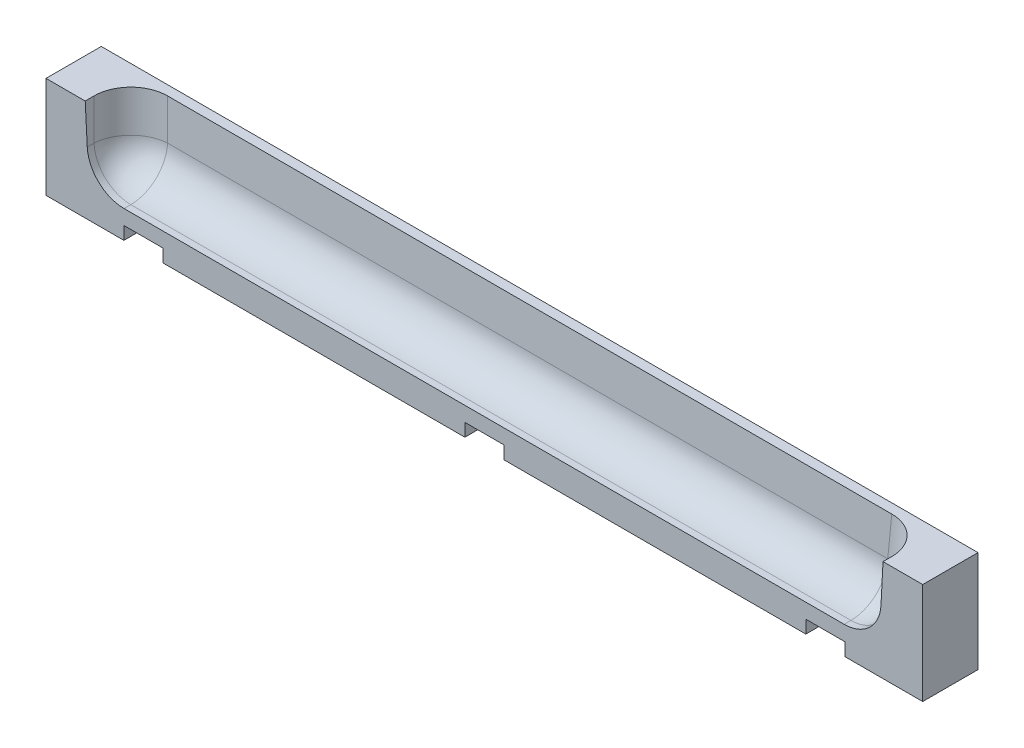
ISO-10303-21;
HEADER;
FILE_DESCRIPTION(('STEP AP214'),'2;1');
FILE_NAME('part.step','',(''),(''),'','','');
FILE_SCHEMA(('AUTOMOTIVE_DESIGN { 1 0 10303 214 1 1 1 1 }'));
ENDSEC;
DATA;
#1=APPLICATION_CONTEXT('core data for automotive mechanical design processes');
#2=APPLICATION_PROTOCOL_DEFINITION('international standard','automotive_design',2000,#1);
#3=PRODUCT_CONTEXT('',#1,'mechanical');
#4=PRODUCT('Part','Part','',(#3));
#5=PRODUCT_RELATED_PRODUCT_CATEGORY('part','',(#4));
#6=PRODUCT_DEFINITION_FORMATION('','',#4);
#7=PRODUCT_DEFINITION_CONTEXT('part definition',#1,'design');
#8=PRODUCT_DEFINITION('design','',#6,#7);
#9=PRODUCT_DEFINITION_SHAPE('','',#8);
#10=(LENGTH_UNIT() NAMED_UNIT(*) SI_UNIT(.MILLI.,.METRE.));
#11=(NAMED_UNIT(*) PLANE_ANGLE_UNIT() SI_UNIT($,.RADIAN.));
#12=(NAMED_UNIT(*) SI_UNIT($,.STERADIAN.) SOLID_ANGLE_UNIT());
#13=UNCERTAINTY_MEASURE_WITH_UNIT(LENGTH_MEASURE(1.E-05),#10,'distance_accuracy_value','');
#14=(GEOMETRIC_REPRESENTATION_CONTEXT(3) GLOBAL_UNCERTAINTY_ASSIGNED_CONTEXT((#13)) GLOBAL_UNIT_ASSIGNED_CONTEXT((#10,
#11,#12)) REPRESENTATION_CONTEXT('',''));
#15=CARTESIAN_POINT('',(0.,0.,0.));
#16=DIRECTION('',(0.,0.,1.));
#17=DIRECTION('',(1.,0.,0.));
#18=AXIS2_PLACEMENT_3D('',#15,#16,#17);
#19=CARTESIAN_POINT('',(-49.2182375036744,20.,-67.8890673333311));
#20=DIRECTION('',(1.,0.,0.));
#21=DIRECTION('',(0.,0.,-1.));
#22=AXIS2_PLACEMENT_3D('',#19,#20,#21);
#23=CYLINDRICAL_SURFACE('',#22,10.);
#24=DIRECTION('',(1.,0.,0.));
#25=VECTOR('',#24,1.);
#26=CARTESIAN_POINT('',(-49.2182375036744,19.4766404375705,-77.8753626808768));
#27=LINE('',#26,#25);
#28=CARTESIAN_POINT('',(42.3499687326921,19.4766404375705,-77.8753626808768));
#29=VERTEX_POINT('',#28);
#30=CARTESIAN_POINT('',(237.697151459334,19.4766404375705,-77.8753626808768));
#31=VERTEX_POINT('',#30);
#32=EDGE_CURVE('E290',#29,#31,#27,.T.);
#33=ORIENTED_EDGE('',*,*,#32,.F.);
#34=CARTESIAN_POINT('',(42.3499687326921,20.,-67.8890673333311));
#35=DIRECTION('',(1.,0.,0.));
#36=DIRECTION('',(0.,0.,-1.));
#37=AXIS2_PLACEMENT_3D('',#34,#35,#36);
#38=CIRCLE('',#37,10.);
#39=CARTESIAN_POINT('',(42.3499687326921,10.,-67.8890673333311));
#40=VERTEX_POINT('',#39);
#41=EDGE_CURVE('E314',#29,#40,#38,.F.);
#42=ORIENTED_EDGE('',*,*,#41,.T.);
#43=DIRECTION('',(1.,0.,0.));
#44=VECTOR('',#43,1.);
#45=CARTESIAN_POINT('',(0.,10.,-67.8890673333311));
#46=LINE('',#45,#44);
#47=CARTESIAN_POINT('',(237.697151459334,10.,-67.8890673333311));
#48=VERTEX_POINT('',#47);
#49=EDGE_CURVE('E281',#48,#40,#46,.F.);
#50=ORIENTED_EDGE('',*,*,#49,.F.);
#51=CARTESIAN_POINT('',(237.697151459334,20.,-67.8890673333311));
#52=DIRECTION('',(1.,0.,0.));
#53=DIRECTION('',(0.,0.,-1.));
#54=AXIS2_PLACEMENT_3D('',#51,#52,#53);
#55=CIRCLE('',#54,10.);
#56=EDGE_CURVE('E312',#48,#31,#55,.T.);
#57=ORIENTED_EDGE('',*,*,#56,.T.);
#58=EDGE_LOOP('',(#33,#42,#50,#57));
#59=FACE_BOUND('',#58,.T.);
#60=ADVANCED_FACE('F43',(#59),#23,.F.);
#61=CARTESIAN_POINT('',(42.3499687326921,20.,-67.8890673333311));
#62=DIRECTION('',(0.,0.,1.));
#63=DIRECTION('',(1.,0.,0.));
#64=AXIS2_PLACEMENT_3D('',#61,#62,#63);
#65=SPHERICAL_SURFACE('',#64,10.);
#66=CARTESIAN_POINT('',(42.3499687326921,20.,-67.8890673333311));
#67=DIRECTION('',(0.,0.,-1.));
#68=DIRECTION('',(-1.,0.,0.));
#69=AXIS2_PLACEMENT_3D('',#66,#67,#68);
#70=CIRCLE('',#69,10.);
#71=CARTESIAN_POINT('',(32.3636733851464,19.4766404375706,-67.8890673333311));
#72=VERTEX_POINT('',#71);
#73=EDGE_CURVE('E316',#40,#72,#70,.T.);
#74=ORIENTED_EDGE('',*,*,#73,.F.);
#75=ORIENTED_EDGE('',*,*,#41,.F.);
#76=CARTESIAN_POINT('',(42.3499687326921,20.,-67.8890673333311));
#77=DIRECTION('',(0.05226442768871,-0.997264688634237,0.0522644276887183));
#78=DIRECTION('',(0.,-0.0523359562429482,-0.998629534754574));
#79=AXIS2_PLACEMENT_3D('',#76,#77,#78);
#80=CIRCLE('',#79,10.);
#81=EDGE_CURVE('E225',#72,#29,#80,.T.);
#82=ORIENTED_EDGE('',*,*,#81,.F.);
#83=EDGE_LOOP('',(#74,#75,#82));
#84=FACE_BOUND('',#83,.T.);
#85=ADVANCED_FACE('F431',(#84),#65,.F.);
#86=CARTESIAN_POINT('',(0.,10.,0.));
#87=DIRECTION('',(0.,-1.,0.));
#88=DIRECTION('',(0.,0.,-1.));
#89=AXIS2_PLACEMENT_3D('',#86,#87,#88);
#90=PLANE('',#89);
#91=DIRECTION('',(0.,0.,-1.));
#92=VECTOR('',#91,1.);
#93=CARTESIAN_POINT('',(42.3499687326921,10.,0.));
#94=LINE('',#93,#92);
#95=CARTESIAN_POINT('',(42.3499687326921,10.,-66.0627350395195));
#96=VERTEX_POINT('',#95);
#97=EDGE_CURVE('E266',#40,#96,#94,.F.);
#98=ORIENTED_EDGE('',*,*,#97,.T.);
#99=DIRECTION('',(1.,0.,0.));
#100=VECTOR('',#99,1.);
#101=CARTESIAN_POINT('',(0.,10.,-66.0627350395195));
#102=LINE('',#101,#100);
#103=CARTESIAN_POINT('',(237.697151459334,10.,-66.0627350395195));
#104=VERTEX_POINT('',#103);
#105=EDGE_CURVE('E327',#96,#104,#102,.T.);
#106=ORIENTED_EDGE('',*,*,#105,.T.);
#107=DIRECTION('',(0.,0.,-1.));
#108=VECTOR('',#107,1.);
#109=CARTESIAN_POINT('',(237.697151459334,10.,-77.3787130004799));
#110=LINE('',#109,#108);
#111=EDGE_CURVE('E284',#104,#48,#110,.T.);
#112=ORIENTED_EDGE('',*,*,#111,.T.);
#113=ORIENTED_EDGE('',*,*,#49,.T.);
#114=EDGE_LOOP('',(#98,#106,#112,#113));
#115=FACE_BOUND('',#114,.T.);
#116=ADVANCED_FACE('F456',(#115),#90,.F.);
#117=CARTESIAN_POINT('',(237.697151459334,20.,-67.8890673333311));
#118=DIRECTION('',(0.,0.,1.));
#119=DIRECTION('',(1.,0.,0.));
#120=AXIS2_PLACEMENT_3D('',#117,#118,#119);
#121=SPHERICAL_SURFACE('',#120,10.);
#122=ORIENTED_EDGE('',*,*,#56,.F.);
#123=CARTESIAN_POINT('',(237.697151459334,20.,-67.8890673333311));
#124=DIRECTION('',(0.,0.,1.));
#125=DIRECTION('',(1.,0.,0.));
#126=AXIS2_PLACEMENT_3D('',#123,#124,#125);
#127=CIRCLE('',#126,10.);
#128=CARTESIAN_POINT('',(247.68344680688,19.4766404375706,-67.8890673333311));
#129=VERTEX_POINT('',#128);
#130=EDGE_CURVE('E318',#129,#48,#127,.F.);
#131=ORIENTED_EDGE('',*,*,#130,.F.);
#132=CARTESIAN_POINT('',(237.697151459334,20.,-67.8890673333311));
#133=DIRECTION('',(-0.0522644276887111,-0.997264688634237,0.0522644276887187));
#134=DIRECTION('',(0.,-0.0523359562429486,-0.998629534754574));
#135=AXIS2_PLACEMENT_3D('',#132,#133,#134);
#136=CIRCLE('',#135,10.);
#137=EDGE_CURVE('E230',#31,#129,#136,.T.);
#138=ORIENTED_EDGE('',*,*,#137,.F.);
#139=EDGE_LOOP('',(#122,#131,#138));
#140=FACE_BOUND('',#139,.T.);
#141=ADVANCED_FACE('F45',(#140),#121,.F.);
#142=CARTESIAN_POINT('',(245.987097241025,-12.8916374986828,-66.0627350395195));
#143=DIRECTION('',(0.998629534754574,-0.0523359562429405,0.));
#144=DIRECTION('',(0.0523359562429405,0.998629534754574,0.));
#145=AXIS2_PLACEMENT_3D('',#142,#143,#144);
#146=PLANE('',#145);
#147=DIRECTION('',(-0.0523359562429405,-0.998629534754574,0.));
#148=VECTOR('',#147,1.);
#149=CARTESIAN_POINT('',(245.987097241025,-12.8916374986828,-66.0627350395195));
#150=LINE('',#149,#148);
#151=CARTESIAN_POINT('',(248.234952712144,30.,-66.0627350395195));
#152=VERTEX_POINT('',#151);
#153=CARTESIAN_POINT('',(247.68344680688,19.4766404375706,-66.0627350395195));
#154=VERTEX_POINT('',#153);
#155=EDGE_CURVE('E234',#152,#154,#150,.T.);
#156=ORIENTED_EDGE('',*,*,#155,.F.);
#157=DIRECTION('',(0.,0.,-1.));
#158=VECTOR('',#157,1.);
#159=CARTESIAN_POINT('',(248.234952712144,30.,-66.0627350395195));
#160=LINE('',#159,#158);
#161=CARTESIAN_POINT('',(248.234952712144,30.,-68.440573238595));
#162=VERTEX_POINT('',#161);
#163=EDGE_CURVE('E401',#152,#162,#160,.T.);
#164=ORIENTED_EDGE('',*,*,#163,.T.);
#165=DIRECTION('',(-0.0522644276887106,-0.997264688634237,0.0522644276887177));
#166=VECTOR('',#165,1.);
#167=CARTESIAN_POINT('',(245.986742184053,-12.8984123893053,-66.1923627105033));
#168=LINE('',#167,#166);
#169=EDGE_CURVE('E310',#162,#129,#168,.T.);
#170=ORIENTED_EDGE('',*,*,#169,.T.);
#171=DIRECTION('',(0.,0.,-1.));
#172=VECTOR('',#171,1.);
#173=CARTESIAN_POINT('',(247.68344680688,19.4766404375706,-66.0627350395195));
#174=LINE('',#173,#172);
#175=EDGE_CURVE('E287',#129,#154,#174,.F.);
#176=ORIENTED_EDGE('',*,*,#175,.T.);
#177=EDGE_LOOP('',(#156,#164,#170,#176));
#178=FACE_BOUND('',#177,.T.);
#179=ADVANCED_FACE('F453',(#178),#146,.F.);
#180=CARTESIAN_POINT('',(236.000446836507,-12.3750528268758,-66.1923627105033));
#181=DIRECTION('',(-0.0522644276887106,-0.997264688634237,0.0522644276887177));
#182=DIRECTION('',(0.,-0.0523359562429476,-0.998629534754574));
#183=AXIS2_PLACEMENT_3D('',#180,#181,#182);
#184=CYLINDRICAL_SURFACE('',#183,10.);
#185=ORIENTED_EDGE('',*,*,#169,.F.);
#186=CARTESIAN_POINT('',(238.221229252165,30.,-68.4131451261616));
#187=DIRECTION('',(0.,-1.,0.));
#188=DIRECTION('',(-0.7071067811865,0.,0.707106781186595));
#189=AXIS2_PLACEMENT_3D('',#186,#187,#188);
#190=ELLIPSE('',#189,10.0274281381557,10.);
#191=CARTESIAN_POINT('',(238.248657364598,30.,-78.4268685861408));
#192=VERTEX_POINT('',#191);
#193=EDGE_CURVE('E319',#162,#192,#190,.F.);
#194=ORIENTED_EDGE('',*,*,#193,.T.);
#195=DIRECTION('',(-0.0522644276887106,-0.997264688634237,0.0522644276887177));
#196=VECTOR('',#195,1.);
#197=CARTESIAN_POINT('',(240.09208770172,65.1747462369226,-80.2702989232625));
#198=LINE('',#197,#196);
#199=EDGE_CURVE('E302',#31,#192,#198,.F.);
#200=ORIENTED_EDGE('',*,*,#199,.F.);
#201=ORIENTED_EDGE('',*,*,#137,.T.);
#202=EDGE_LOOP('',(#185,#194,#200,#201));
#203=FACE_BOUND('',#202,.T.);
#204=ADVANCED_FACE('F443',(#203),#184,.F.);
#205=CARTESIAN_POINT('',(-49.2182375036744,80.2953280875141,-81.0627350395195));
#206=DIRECTION('',(0.,0.0523359562429476,0.998629534754574));
#207=DIRECTION('',(0.,-0.998629534754574,0.0523359562429476));
#208=AXIS2_PLACEMENT_3D('',#205,#206,#207);
#209=PLANE('',#208);
#210=DIRECTION('',(1.,0.,0.));
#211=VECTOR('',#210,1.);
#212=CARTESIAN_POINT('',(-49.2182375036744,30.,-78.4268685861408));
#213=LINE('',#212,#211);
#214=CARTESIAN_POINT('',(41.7984628274282,30.,-78.4268685861408));
#215=VERTEX_POINT('',#214);
#216=EDGE_CURVE('E399',#215,#192,#213,.T.);
#217=ORIENTED_EDGE('',*,*,#216,.F.);
#218=DIRECTION('',(0.0522644276887101,-0.997264688634237,0.0522644276887177));
#219=VECTOR('',#218,1.);
#220=CARTESIAN_POINT('',(42.3226904638988,19.9971408130197,-77.9026409496701));
#221=LINE('',#220,#219);
#222=EDGE_CURVE('E305',#215,#29,#221,.T.);
#223=ORIENTED_EDGE('',*,*,#222,.T.);
#224=ORIENTED_EDGE('',*,*,#32,.T.);
#225=ORIENTED_EDGE('',*,*,#199,.T.);
#226=EDGE_LOOP('',(#217,#223,#224,#225));
#227=FACE_BOUND('',#226,.T.);
#228=ADVANCED_FACE('F439',(#227),#209,.T.);
#229=CARTESIAN_POINT('',(38.9211779041582,85.4252264728883,-71.3178581618655));
#230=DIRECTION('',(-0.0522644276887101,0.997264688634237,-0.0522644276887177));
#231=DIRECTION('',(0.,0.0523359562429476,0.998629534754574));
#232=AXIS2_PLACEMENT_3D('',#229,#230,#231);
#233=CYLINDRICAL_SURFACE('',#232,10.);
#234=ORIENTED_EDGE('',*,*,#222,.F.);
#235=CARTESIAN_POINT('',(41.8258909398617,30.,-68.4131451261616));
#236=DIRECTION('',(0.,-1.,0.));
#237=DIRECTION('',(-0.707106781186496,0.,-0.707106781186599));
#238=AXIS2_PLACEMENT_3D('',#235,#236,#237);
#239=ELLIPSE('',#238,10.0274281381557,10.);
#240=CARTESIAN_POINT('',(31.8121674798825,30.,-68.440573238595));
#241=VERTEX_POINT('',#240);
#242=EDGE_CURVE('E404',#215,#241,#239,.F.);
#243=ORIENTED_EDGE('',*,*,#242,.T.);
#244=DIRECTION('',(0.0522644276887101,-0.997264688634237,0.0522644276887177));
#245=VECTOR('',#244,1.);
#246=CARTESIAN_POINT('',(29.1490227577108,80.8158284629633,-71.1037179607671));
#247=LINE('',#246,#245);
#248=EDGE_CURVE('E307',#72,#241,#247,.F.);
#249=ORIENTED_EDGE('',*,*,#248,.F.);
#250=ORIENTED_EDGE('',*,*,#81,.T.);
#251=EDGE_LOOP('',(#234,#243,#249,#250));
#252=FACE_BOUND('',#251,.T.);
#253=ADVANCED_FACE('F427',(#252),#233,.F.);
#254=CARTESIAN_POINT('',(33.2929592378888,1.74481005941844,-66.0627350395195));
#255=DIRECTION('',(0.998629534754574,0.05233595624294,0.));
#256=DIRECTION('',(-0.05233595624294,0.998629534754574,0.));
#257=AXIS2_PLACEMENT_3D('',#254,#255,#256);
#258=PLANE('',#257);
#259=DIRECTION('',(0.,0.,-1.));
#260=VECTOR('',#259,1.);
#261=CARTESIAN_POINT('',(31.8121674798825,30.,-66.0627350395195));
#262=LINE('',#261,#260);
#263=CARTESIAN_POINT('',(31.8121674798825,30.,-66.0627350395195));
#264=VERTEX_POINT('',#263);
#265=EDGE_CURVE('E407',#264,#241,#262,.T.);
#266=ORIENTED_EDGE('',*,*,#265,.F.);
#267=DIRECTION('',(0.05233595624294,-0.998629534754574,0.));
#268=VECTOR('',#267,1.);
#269=CARTESIAN_POINT('',(33.2929592378888,1.74481005941844,-66.0627350395195));
#270=LINE('',#269,#268);
#271=CARTESIAN_POINT('',(32.3636733851464,19.4766404375706,-66.0627350395195));
#272=VERTEX_POINT('',#271);
#273=EDGE_CURVE('E227',#264,#272,#270,.T.);
#274=ORIENTED_EDGE('',*,*,#273,.T.);
#275=DIRECTION('',(0.,0.,-1.));
#276=VECTOR('',#275,1.);
#277=CARTESIAN_POINT('',(32.3636733851464,19.4766404375706,-66.0627350395195));
#278=LINE('',#277,#276);
#279=EDGE_CURVE('E293',#272,#72,#278,.T.);
#280=ORIENTED_EDGE('',*,*,#279,.T.);
#281=ORIENTED_EDGE('',*,*,#248,.T.);
#282=EDGE_LOOP('',(#266,#274,#280,#281));
#283=FACE_BOUND('',#282,.T.);
#284=ADVANCED_FACE('F421',(#283),#258,.T.);
#285=CARTESIAN_POINT('',(21.1735600960133,30.,-81.0627350395195));
#286=DIRECTION('',(0.,-1.,0.));
#287=DIRECTION('',(1.,0.,0.));
#288=AXIS2_PLACEMENT_3D('',#285,#286,#287);
#289=PLANE('',#288);
#290=DIRECTION('',(-1.,0.,0.));
#291=VECTOR('',#290,1.);
#292=CARTESIAN_POINT('',(0.,30.,-66.0627350395195));
#293=LINE('',#292,#291);
#294=CARTESIAN_POINT('',(259.,30.,-66.0627350395195));
#295=VERTEX_POINT('',#294);
#296=EDGE_CURVE('E409',#295,#152,#293,.T.);
#297=ORIENTED_EDGE('',*,*,#296,.F.);
#298=DIRECTION('',(0.,0.,1.));
#299=VECTOR('',#298,1.);
#300=CARTESIAN_POINT('',(259.,30.,-81.0627350395195));
#301=LINE('',#300,#299);
#302=CARTESIAN_POINT('',(259.,30.,-81.0627350395195));
#303=VERTEX_POINT('',#302);
#304=EDGE_CURVE('E388',#303,#295,#301,.T.);
#305=ORIENTED_EDGE('',*,*,#304,.F.);
#306=DIRECTION('',(1.,0.,0.));
#307=VECTOR('',#306,1.);
#308=CARTESIAN_POINT('',(21.1735600960133,30.,-81.0627350395195));
#309=LINE('',#308,#307);
#310=CARTESIAN_POINT('',(21.1735600960133,30.,-81.0627350395195));
#311=VERTEX_POINT('',#310);
#312=EDGE_CURVE('E390',#311,#303,#309,.T.);
#313=ORIENTED_EDGE('',*,*,#312,.F.);
#314=DIRECTION('',(0.,0.,1.));
#315=VECTOR('',#314,1.);
#316=CARTESIAN_POINT('',(21.1735600960133,30.,-81.0627350395195));
#317=LINE('',#316,#315);
#318=CARTESIAN_POINT('',(21.1735600960133,30.,-66.0627350395195));
#319=VERTEX_POINT('',#318);
#320=EDGE_CURVE('E223',#311,#319,#317,.T.);
#321=ORIENTED_EDGE('',*,*,#320,.T.);
#322=DIRECTION('',(-1.,0.,0.));
#323=VECTOR('',#322,1.);
#324=CARTESIAN_POINT('',(0.,30.,-66.0627350395195));
#325=LINE('',#324,#323);
#326=EDGE_CURVE('E323',#264,#319,#325,.T.);
#327=ORIENTED_EDGE('',*,*,#326,.F.);
#328=ORIENTED_EDGE('',*,*,#265,.T.);
#329=ORIENTED_EDGE('',*,*,#242,.F.);
#330=ORIENTED_EDGE('',*,*,#216,.T.);
#331=ORIENTED_EDGE('',*,*,#193,.F.);
#332=ORIENTED_EDGE('',*,*,#163,.F.);
#333=EDGE_LOOP('',(#297,#305,#313,#321,#327,#328,#329,#330,#331,#332));
#334=FACE_BOUND('',#333,.T.);
#335=ADVANCED_FACE('F419',(#334),#289,.F.);
#336=CARTESIAN_POINT('',(237.697151459334,20.,0.));
#337=DIRECTION('',(0.,0.,1.));
#338=DIRECTION('',(1.,0.,0.));
#339=AXIS2_PLACEMENT_3D('',#336,#337,#338);
#340=CYLINDRICAL_SURFACE('',#339,10.);
#341=ORIENTED_EDGE('',*,*,#175,.F.);
#342=ORIENTED_EDGE('',*,*,#130,.T.);
#343=ORIENTED_EDGE('',*,*,#111,.F.);
#344=CARTESIAN_POINT('',(237.697151459334,20.,-66.0627350395195));
#345=DIRECTION('',(0.,0.,-1.));
#346=DIRECTION('',(-1.,0.,0.));
#347=AXIS2_PLACEMENT_3D('',#344,#345,#346);
#348=CIRCLE('',#347,10.);
#349=EDGE_CURVE('E296',#154,#104,#348,.T.);
#350=ORIENTED_EDGE('',*,*,#349,.F.);
#351=EDGE_LOOP('',(#341,#342,#343,#350));
#352=FACE_BOUND('',#351,.T.);
#353=ADVANCED_FACE('F450',(#352),#340,.F.);
#354=CARTESIAN_POINT('',(42.3499687326921,20.,-66.0627350395195));
#355=DIRECTION('',(0.,0.,-1.));
#356=DIRECTION('',(-1.,0.,0.));
#357=AXIS2_PLACEMENT_3D('',#354,#355,#356);
#358=CYLINDRICAL_SURFACE('',#357,10.);
#359=ORIENTED_EDGE('',*,*,#97,.F.);
#360=ORIENTED_EDGE('',*,*,#73,.T.);
#361=ORIENTED_EDGE('',*,*,#279,.F.);
#362=CARTESIAN_POINT('',(42.3499687326921,20.,-66.0627350395195));
#363=DIRECTION('',(0.,0.,-1.));
#364=DIRECTION('',(-1.,0.,0.));
#365=AXIS2_PLACEMENT_3D('',#362,#363,#364);
#366=CIRCLE('',#365,10.);
#367=EDGE_CURVE('E299',#96,#272,#366,.T.);
#368=ORIENTED_EDGE('',*,*,#367,.F.);
#369=EDGE_LOOP('',(#359,#360,#361,#368));
#370=FACE_BOUND('',#369,.T.);
#371=ADVANCED_FACE('F460',(#370),#358,.F.);
#372=CARTESIAN_POINT('',(0.,10.,-81.0627350395195));
#373=DIRECTION('',(0.,0.,1.));
#374=DIRECTION('',(1.,0.,0.));
#375=AXIS2_PLACEMENT_3D('',#372,#373,#374);
#376=PLANE('',#375);
#377=DIRECTION('',(0.,1.,0.));
#378=VECTOR('',#377,1.);
#379=CARTESIAN_POINT('',(259.,0.,-81.0627350395195));
#380=LINE('',#379,#378);
#381=CARTESIAN_POINT('',(259.,2.5,-81.0627350395195));
#382=VERTEX_POINT('',#381);
#383=EDGE_CURVE('E210',#382,#303,#380,.T.);
#384=ORIENTED_EDGE('',*,*,#383,.F.);
#385=DIRECTION('',(-1.,0.,0.));
#386=VECTOR('',#385,1.);
#387=CARTESIAN_POINT('',(259.,2.5,-81.0627350395195));
#388=LINE('',#387,#386);
#389=CARTESIAN_POINT('',(21.173560096013,2.5,-81.0627350395195));
#390=VERTEX_POINT('',#389);
#391=EDGE_CURVE('E58',#382,#390,#388,.T.);
#392=ORIENTED_EDGE('',*,*,#391,.T.);
#393=DIRECTION('',(0.,1.,0.));
#394=VECTOR('',#393,1.);
#395=CARTESIAN_POINT('',(21.173560096013,0.,-81.0627350395195));
#396=LINE('',#395,#394);
#397=EDGE_CURVE('E216',#390,#311,#396,.T.);
#398=ORIENTED_EDGE('',*,*,#397,.T.);
#399=ORIENTED_EDGE('',*,*,#312,.T.);
#400=EDGE_LOOP('',(#384,#392,#398,#399));
#401=FACE_BOUND('',#400,.T.);
#402=ADVANCED_FACE('F214',(#401),#376,.F.);
#403=CARTESIAN_POINT('',(0.,0.,-66.0627350395195));
#404=DIRECTION('',(0.,0.,-1.));
#405=DIRECTION('',(-1.,0.,0.));
#406=AXIS2_PLACEMENT_3D('',#403,#404,#405);
#407=PLANE('',#406);
#408=DIRECTION('',(0.,1.,0.));
#409=VECTOR('',#408,1.);
#410=CARTESIAN_POINT('',(21.173560096013,0.,-66.0627350395195));
#411=LINE('',#410,#409);
#412=CARTESIAN_POINT('',(21.173560096013,2.5,-66.0627350395195));
#413=VERTEX_POINT('',#412);
#414=EDGE_CURVE('E224',#413,#319,#411,.T.);
#415=ORIENTED_EDGE('',*,*,#414,.F.);
#416=DIRECTION('',(1.,0.,0.));
#417=VECTOR('',#416,1.);
#418=CARTESIAN_POINT('',(0.,2.5,-66.0627350395195));
#419=LINE('',#418,#417);
#420=CARTESIAN_POINT('',(42.3,2.5,-66.0627350395195));
#421=VERTEX_POINT('',#420);
#422=EDGE_CURVE('E206',#413,#421,#419,.T.);
#423=ORIENTED_EDGE('',*,*,#422,.T.);
#424=DIRECTION('',(0.,-1.,0.));
#425=VECTOR('',#424,1.);
#426=CARTESIAN_POINT('',(42.3,6.,-66.0627350395195));
#427=LINE('',#426,#425);
#428=CARTESIAN_POINT('',(42.3,6.,-66.0627350395195));
#429=VERTEX_POINT('',#428);
#430=EDGE_CURVE('E339',#429,#421,#427,.T.);
#431=ORIENTED_EDGE('',*,*,#430,.F.);
#432=DIRECTION('',(-1.,0.,0.));
#433=VECTOR('',#432,1.);
#434=CARTESIAN_POINT('',(0.,6.,-66.0627350395195));
#435=LINE('',#434,#433);
#436=CARTESIAN_POINT('',(52.9,6.,-66.0627350395195));
#437=VERTEX_POINT('',#436);
#438=EDGE_CURVE('E335',#437,#429,#435,.T.);
#439=ORIENTED_EDGE('',*,*,#438,.F.);
#440=DIRECTION('',(0.,1.,0.));
#441=VECTOR('',#440,1.);
#442=CARTESIAN_POINT('',(52.9,6.,-66.0627350395195));
#443=LINE('',#442,#441);
#444=CARTESIAN_POINT('',(52.9,2.5,-66.0627350395195));
#445=VERTEX_POINT('',#444);
#446=EDGE_CURVE('E337',#445,#437,#443,.T.);
#447=ORIENTED_EDGE('',*,*,#446,.F.);
#448=CARTESIAN_POINT('',(134.8,2.5,-66.0627350395195));
#449=VERTEX_POINT('',#448);
#450=EDGE_CURVE('E358',#445,#449,#419,.T.);
#451=ORIENTED_EDGE('',*,*,#450,.T.);
#452=DIRECTION('',(0.,-1.,0.));
#453=VECTOR('',#452,1.);
#454=CARTESIAN_POINT('',(134.8,6.,-66.0627350395195));
#455=LINE('',#454,#453);
#456=CARTESIAN_POINT('',(134.8,6.,-66.0627350395195));
#457=VERTEX_POINT('',#456);
#458=EDGE_CURVE('E330',#457,#449,#455,.T.);
#459=ORIENTED_EDGE('',*,*,#458,.F.);
#460=DIRECTION('',(1.,0.,0.));
#461=VECTOR('',#460,1.);
#462=CARTESIAN_POINT('',(0.,6.,-66.0627350395195));
#463=LINE('',#462,#461);
#464=CARTESIAN_POINT('',(145.4,6.,-66.0627350395195));
#465=VERTEX_POINT('',#464);
#466=EDGE_CURVE('E329',#457,#465,#463,.T.);
#467=ORIENTED_EDGE('',*,*,#466,.T.);
#468=DIRECTION('',(0.,1.,0.));
#469=VECTOR('',#468,1.);
#470=CARTESIAN_POINT('',(145.4,6.,-66.0627350395195));
#471=LINE('',#470,#469);
#472=CARTESIAN_POINT('',(145.4,2.5,-66.0627350395195));
#473=VERTEX_POINT('',#472);
#474=EDGE_CURVE('E342',#473,#465,#471,.T.);
#475=ORIENTED_EDGE('',*,*,#474,.F.);
#476=CARTESIAN_POINT('',(227.3,2.5,-66.0627350395195));
#477=VERTEX_POINT('',#476);
#478=EDGE_CURVE('E369',#473,#477,#419,.T.);
#479=ORIENTED_EDGE('',*,*,#478,.T.);
#480=DIRECTION('',(0.,-1.,0.));
#481=VECTOR('',#480,1.);
#482=CARTESIAN_POINT('',(227.3,6.,-66.0627350395195));
#483=LINE('',#482,#481);
#484=CARTESIAN_POINT('',(227.3,6.,-66.0627350395195));
#485=VERTEX_POINT('',#484);
#486=EDGE_CURVE('E326',#485,#477,#483,.T.);
#487=ORIENTED_EDGE('',*,*,#486,.F.);
#488=DIRECTION('',(1.,0.,0.));
#489=VECTOR('',#488,1.);
#490=CARTESIAN_POINT('',(0.,6.,-66.0627350395195));
#491=LINE('',#490,#489);
#492=CARTESIAN_POINT('',(237.9,6.,-66.0627350395195));
#493=VERTEX_POINT('',#492);
#494=EDGE_CURVE('E51',#485,#493,#491,.T.);
#495=ORIENTED_EDGE('',*,*,#494,.T.);
#496=DIRECTION('',(0.,1.,0.));
#497=VECTOR('',#496,1.);
#498=CARTESIAN_POINT('',(237.9,6.,-66.0627350395195));
#499=LINE('',#498,#497);
#500=CARTESIAN_POINT('',(237.9,2.5,-66.0627350395195));
#501=VERTEX_POINT('',#500);
#502=EDGE_CURVE('E65',#501,#493,#499,.T.);
#503=ORIENTED_EDGE('',*,*,#502,.F.);
#504=CARTESIAN_POINT('',(259.,2.5,-66.0627350395195));
#505=VERTEX_POINT('',#504);
#506=EDGE_CURVE('E371',#501,#505,#419,.T.);
#507=ORIENTED_EDGE('',*,*,#506,.T.);
#508=DIRECTION('',(0.,1.,0.));
#509=VECTOR('',#508,1.);
#510=CARTESIAN_POINT('',(259.,0.,-66.0627350395195));
#511=LINE('',#510,#509);
#512=EDGE_CURVE('E382',#505,#295,#511,.T.);
#513=ORIENTED_EDGE('',*,*,#512,.T.);
#514=ORIENTED_EDGE('',*,*,#296,.T.);
#515=ORIENTED_EDGE('',*,*,#155,.T.);
#516=ORIENTED_EDGE('',*,*,#349,.T.);
#517=ORIENTED_EDGE('',*,*,#105,.F.);
#518=ORIENTED_EDGE('',*,*,#367,.T.);
#519=ORIENTED_EDGE('',*,*,#273,.F.);
#520=ORIENTED_EDGE('',*,*,#326,.T.);
#521=EDGE_LOOP('',(#415,#423,#431,#439,#447,#451,#459,#467,#475,#479,#487,#495,#503,#507,#513,
#514,#515,#516,#517,#518,#519,#520));
#522=FACE_BOUND('',#521,.T.);
#523=ADVANCED_FACE('F355',(#522),#407,.F.);
#524=CARTESIAN_POINT('',(21.173560096013,0.,-66.0627350395195));
#525=DIRECTION('',(-1.,0.,0.));
#526=DIRECTION('',(0.,-1.,0.));
#527=AXIS2_PLACEMENT_3D('',#524,#525,#526);
#528=PLANE('',#527);
#529=DIRECTION('',(0.,0.,-1.));
#530=VECTOR('',#529,1.);
#531=CARTESIAN_POINT('',(21.173560096013,2.5,-66.0627350395195));
#532=LINE('',#531,#530);
#533=EDGE_CURVE('E203',#413,#390,#532,.T.);
#534=ORIENTED_EDGE('',*,*,#533,.F.);
#535=ORIENTED_EDGE('',*,*,#414,.T.);
#536=ORIENTED_EDGE('',*,*,#320,.F.);
#537=ORIENTED_EDGE('',*,*,#397,.F.);
#538=EDGE_LOOP('',(#534,#535,#536,#537));
#539=FACE_BOUND('',#538,.T.);
#540=ADVANCED_FACE('F221',(#539),#528,.T.);
#541=CARTESIAN_POINT('',(134.8,6.,-59.6));
#542=DIRECTION('',(-1.,0.,0.));
#543=DIRECTION('',(0.,0.,1.));
#544=AXIS2_PLACEMENT_3D('',#541,#542,#543);
#545=PLANE('',#544);
#546=ORIENTED_EDGE('',*,*,#458,.T.);
#547=DIRECTION('',(0.,0.,-1.));
#548=VECTOR('',#547,1.);
#549=CARTESIAN_POINT('',(134.8,2.5,-59.6));
#550=LINE('',#549,#548);
#551=CARTESIAN_POINT('',(134.8,2.5,-70.2));
#552=VERTEX_POINT('',#551);
#553=EDGE_CURVE('E351',#449,#552,#550,.T.);
#554=ORIENTED_EDGE('',*,*,#553,.T.);
#555=DIRECTION('',(0.,-1.,0.));
#556=VECTOR('',#555,1.);
#557=CARTESIAN_POINT('',(134.8,6.,-70.2));
#558=LINE('',#557,#556);
#559=CARTESIAN_POINT('',(134.8,6.,-70.2));
#560=VERTEX_POINT('',#559);
#561=EDGE_CURVE('E237',#560,#552,#558,.T.);
#562=ORIENTED_EDGE('',*,*,#561,.F.);
#563=DIRECTION('',(0.,0.,-1.));
#564=VECTOR('',#563,1.);
#565=CARTESIAN_POINT('',(134.8,6.,-59.6));
#566=LINE('',#565,#564);
#567=EDGE_CURVE('E248',#457,#560,#566,.T.);
#568=ORIENTED_EDGE('',*,*,#567,.F.);
#569=EDGE_LOOP('',(#546,#554,#562,#568));
#570=FACE_BOUND('',#569,.T.);
#571=ADVANCED_FACE('F349',(#570),#545,.F.);
#572=CARTESIAN_POINT('',(145.4,6.,-59.6));
#573=DIRECTION('',(1.,0.,0.));
#574=DIRECTION('',(0.,0.,-1.));
#575=AXIS2_PLACEMENT_3D('',#572,#573,#574);
#576=PLANE('',#575);
#577=DIRECTION('',(0.,-1.,0.));
#578=VECTOR('',#577,1.);
#579=CARTESIAN_POINT('',(145.4,6.,-70.2));
#580=LINE('',#579,#578);
#581=CARTESIAN_POINT('',(145.4,6.,-70.2));
#582=VERTEX_POINT('',#581);
#583=CARTESIAN_POINT('',(145.4,2.5,-70.2));
#584=VERTEX_POINT('',#583);
#585=EDGE_CURVE('E236',#582,#584,#580,.T.);
#586=ORIENTED_EDGE('',*,*,#585,.T.);
#587=DIRECTION('',(0.,0.,1.));
#588=VECTOR('',#587,1.);
#589=CARTESIAN_POINT('',(145.4,2.5,-59.6));
#590=LINE('',#589,#588);
#591=EDGE_CURVE('E366',#584,#473,#590,.T.);
#592=ORIENTED_EDGE('',*,*,#591,.T.);
#593=ORIENTED_EDGE('',*,*,#474,.T.);
#594=DIRECTION('',(0.,0.,1.));
#595=VECTOR('',#594,1.);
#596=CARTESIAN_POINT('',(145.4,6.,-59.6));
#597=LINE('',#596,#595);
#598=EDGE_CURVE('E240',#582,#465,#597,.T.);
#599=ORIENTED_EDGE('',*,*,#598,.F.);
#600=EDGE_LOOP('',(#586,#592,#593,#599));
#601=FACE_BOUND('',#600,.T.);
#602=ADVANCED_FACE('F364',(#601),#576,.F.);
#603=CARTESIAN_POINT('',(134.8,6.,-70.2));
#604=DIRECTION('',(0.,0.,-1.));
#605=DIRECTION('',(-1.,0.,0.));
#606=AXIS2_PLACEMENT_3D('',#603,#604,#605);
#607=PLANE('',#606);
#608=ORIENTED_EDGE('',*,*,#561,.T.);
#609=DIRECTION('',(1.,0.,0.));
#610=VECTOR('',#609,1.);
#611=CARTESIAN_POINT('',(134.8,2.5,-70.2));
#612=LINE('',#611,#610);
#613=EDGE_CURVE('E543',#552,#584,#612,.T.);
#614=ORIENTED_EDGE('',*,*,#613,.T.);
#615=ORIENTED_EDGE('',*,*,#585,.F.);
#616=DIRECTION('',(1.,0.,0.));
#617=VECTOR('',#616,1.);
#618=CARTESIAN_POINT('',(134.8,6.,-70.2));
#619=LINE('',#618,#617);
#620=EDGE_CURVE('E245',#560,#582,#619,.T.);
#621=ORIENTED_EDGE('',*,*,#620,.F.);
#622=EDGE_LOOP('',(#608,#614,#615,#621));
#623=FACE_BOUND('',#622,.T.);
#624=ADVANCED_FACE('F523',(#623),#607,.F.);
#625=CARTESIAN_POINT('',(0.,6.,0.));
#626=DIRECTION('',(0.,-1.,0.));
#627=DIRECTION('',(0.,0.,-1.));
#628=AXIS2_PLACEMENT_3D('',#625,#626,#627);
#629=PLANE('',#628);
#630=ORIENTED_EDGE('',*,*,#466,.F.);
#631=ORIENTED_EDGE('',*,*,#567,.T.);
#632=ORIENTED_EDGE('',*,*,#620,.T.);
#633=ORIENTED_EDGE('',*,*,#598,.T.);
#634=EDGE_LOOP('',(#630,#631,#632,#633));
#635=FACE_BOUND('',#634,.T.);
#636=ADVANCED_FACE('F360',(#635),#629,.T.);
#637=CARTESIAN_POINT('',(42.3,6.,-70.2));
#638=DIRECTION('',(-1.,0.,0.));
#639=DIRECTION('',(0.,0.,1.));
#640=AXIS2_PLACEMENT_3D('',#637,#638,#639);
#641=PLANE('',#640);
#642=ORIENTED_EDGE('',*,*,#430,.T.);
#643=DIRECTION('',(0.,0.,-1.));
#644=VECTOR('',#643,1.);
#645=CARTESIAN_POINT('',(42.3,2.5,-70.2));
#646=LINE('',#645,#644);
#647=CARTESIAN_POINT('',(42.3,2.5,-70.2));
#648=VERTEX_POINT('',#647);
#649=EDGE_CURVE('E553',#421,#648,#646,.T.);
#650=ORIENTED_EDGE('',*,*,#649,.T.);
#651=DIRECTION('',(0.,-1.,0.));
#652=VECTOR('',#651,1.);
#653=CARTESIAN_POINT('',(42.3,6.,-70.2));
#654=LINE('',#653,#652);
#655=CARTESIAN_POINT('',(42.3,6.,-70.2));
#656=VERTEX_POINT('',#655);
#657=EDGE_CURVE('E267',#656,#648,#654,.T.);
#658=ORIENTED_EDGE('',*,*,#657,.F.);
#659=DIRECTION('',(0.,0.,-1.));
#660=VECTOR('',#659,1.);
#661=CARTESIAN_POINT('',(42.3,6.,-70.2));
#662=LINE('',#661,#660);
#663=EDGE_CURVE('E258',#429,#656,#662,.T.);
#664=ORIENTED_EDGE('',*,*,#663,.F.);
#665=EDGE_LOOP('',(#642,#650,#658,#664));
#666=FACE_BOUND('',#665,.T.);
#667=ADVANCED_FACE('F484',(#666),#641,.F.);
#668=CARTESIAN_POINT('',(52.9,6.,-70.2));
#669=DIRECTION('',(1.,0.,0.));
#670=DIRECTION('',(0.,0.,-1.));
#671=AXIS2_PLACEMENT_3D('',#668,#669,#670);
#672=PLANE('',#671);
#673=DIRECTION('',(0.,-1.,0.));
#674=VECTOR('',#673,1.);
#675=CARTESIAN_POINT('',(52.9,6.,-70.2));
#676=LINE('',#675,#674);
#677=CARTESIAN_POINT('',(52.9,6.,-70.2));
#678=VERTEX_POINT('',#677);
#679=CARTESIAN_POINT('',(52.9,2.5,-70.2));
#680=VERTEX_POINT('',#679);
#681=EDGE_CURVE('E250',#678,#680,#676,.T.);
#682=ORIENTED_EDGE('',*,*,#681,.T.);
#683=DIRECTION('',(0.,0.,1.));
#684=VECTOR('',#683,1.);
#685=CARTESIAN_POINT('',(52.9,2.5,-70.2));
#686=LINE('',#685,#684);
#687=EDGE_CURVE('E547',#680,#445,#686,.T.);
#688=ORIENTED_EDGE('',*,*,#687,.T.);
#689=ORIENTED_EDGE('',*,*,#446,.T.);
#690=DIRECTION('',(0.,0.,1.));
#691=VECTOR('',#690,1.);
#692=CARTESIAN_POINT('',(52.9,6.,-70.2));
#693=LINE('',#692,#691);
#694=EDGE_CURVE('E270',#678,#437,#693,.T.);
#695=ORIENTED_EDGE('',*,*,#694,.F.);
#696=EDGE_LOOP('',(#682,#688,#689,#695));
#697=FACE_BOUND('',#696,.T.);
#698=ADVANCED_FACE('F487',(#697),#672,.F.);
#699=CARTESIAN_POINT('',(42.3,6.,-70.2));
#700=DIRECTION('',(0.,0.,-1.));
#701=DIRECTION('',(-1.,0.,0.));
#702=AXIS2_PLACEMENT_3D('',#699,#700,#701);
#703=PLANE('',#702);
#704=ORIENTED_EDGE('',*,*,#657,.T.);
#705=DIRECTION('',(1.,0.,0.));
#706=VECTOR('',#705,1.);
#707=CARTESIAN_POINT('',(42.3,2.5,-70.2));
#708=LINE('',#707,#706);
#709=EDGE_CURVE('E550',#648,#680,#708,.T.);
#710=ORIENTED_EDGE('',*,*,#709,.T.);
#711=ORIENTED_EDGE('',*,*,#681,.F.);
#712=DIRECTION('',(1.,0.,0.));
#713=VECTOR('',#712,1.);
#714=CARTESIAN_POINT('',(42.3,6.,-70.2));
#715=LINE('',#714,#713);
#716=EDGE_CURVE('E275',#656,#678,#715,.T.);
#717=ORIENTED_EDGE('',*,*,#716,.F.);
#718=EDGE_LOOP('',(#704,#710,#711,#717));
#719=FACE_BOUND('',#718,.T.);
#720=ADVANCED_FACE('F489',(#719),#703,.F.);
#721=CARTESIAN_POINT('',(0.,6.,0.));
#722=DIRECTION('',(0.,1.,0.));
#723=DIRECTION('',(0.,0.,1.));
#724=AXIS2_PLACEMENT_3D('',#721,#722,#723);
#725=PLANE('',#724);
#726=ORIENTED_EDGE('',*,*,#694,.T.);
#727=ORIENTED_EDGE('',*,*,#438,.T.);
#728=ORIENTED_EDGE('',*,*,#663,.T.);
#729=ORIENTED_EDGE('',*,*,#716,.T.);
#730=EDGE_LOOP('',(#726,#727,#728,#729));
#731=FACE_BOUND('',#730,.T.);
#732=ADVANCED_FACE('F492',(#731),#725,.F.);
#733=CARTESIAN_POINT('',(237.9,6.,-70.2));
#734=DIRECTION('',(1.,0.,0.));
#735=DIRECTION('',(0.,0.,-1.));
#736=AXIS2_PLACEMENT_3D('',#733,#734,#735);
#737=PLANE('',#736);
#738=DIRECTION('',(0.,-1.,0.));
#739=VECTOR('',#738,1.);
#740=CARTESIAN_POINT('',(237.9,6.,-70.2));
#741=LINE('',#740,#739);
#742=CARTESIAN_POINT('',(237.9,6.,-70.2));
#743=VERTEX_POINT('',#742);
#744=CARTESIAN_POINT('',(237.9,2.5,-70.2));
#745=VERTEX_POINT('',#744);
#746=EDGE_CURVE('E255',#743,#745,#741,.T.);
#747=ORIENTED_EDGE('',*,*,#746,.T.);
#748=DIRECTION('',(0.,0.,1.));
#749=VECTOR('',#748,1.);
#750=CARTESIAN_POINT('',(237.9,2.5,-70.2));
#751=LINE('',#750,#749);
#752=EDGE_CURVE('E384',#745,#501,#751,.T.);
#753=ORIENTED_EDGE('',*,*,#752,.T.);
#754=ORIENTED_EDGE('',*,*,#502,.T.);
#755=DIRECTION('',(0.,0.,1.));
#756=VECTOR('',#755,1.);
#757=CARTESIAN_POINT('',(237.9,6.,-70.2));
#758=LINE('',#757,#756);
#759=EDGE_CURVE('E263',#743,#493,#758,.T.);
#760=ORIENTED_EDGE('',*,*,#759,.F.);
#761=EDGE_LOOP('',(#747,#753,#754,#760));
#762=FACE_BOUND('',#761,.T.);
#763=ADVANCED_FACE('F499',(#762),#737,.F.);
#764=CARTESIAN_POINT('',(237.9,6.,-70.2));
#765=DIRECTION('',(0.,0.,-1.));
#766=DIRECTION('',(-1.,0.,0.));
#767=AXIS2_PLACEMENT_3D('',#764,#765,#766);
#768=PLANE('',#767);
#769=DIRECTION('',(0.,-1.,0.));
#770=VECTOR('',#769,1.);
#771=CARTESIAN_POINT('',(227.3,6.,-70.2));
#772=LINE('',#771,#770);
#773=CARTESIAN_POINT('',(227.3,6.,-70.2));
#774=VERTEX_POINT('',#773);
#775=CARTESIAN_POINT('',(227.3,2.5,-70.2));
#776=VERTEX_POINT('',#775);
#777=EDGE_CURVE('E251',#774,#776,#772,.T.);
#778=ORIENTED_EDGE('',*,*,#777,.T.);
#779=DIRECTION('',(1.,0.,0.));
#780=VECTOR('',#779,1.);
#781=CARTESIAN_POINT('',(237.9,2.5,-70.2));
#782=LINE('',#781,#780);
#783=EDGE_CURVE('E537',#776,#745,#782,.T.);
#784=ORIENTED_EDGE('',*,*,#783,.T.);
#785=ORIENTED_EDGE('',*,*,#746,.F.);
#786=DIRECTION('',(1.,0.,0.));
#787=VECTOR('',#786,1.);
#788=CARTESIAN_POINT('',(237.9,6.,-70.2));
#789=LINE('',#788,#787);
#790=EDGE_CURVE('E254',#774,#743,#789,.T.);
#791=ORIENTED_EDGE('',*,*,#790,.F.);
#792=EDGE_LOOP('',(#778,#784,#785,#791));
#793=FACE_BOUND('',#792,.T.);
#794=ADVANCED_FACE('F480',(#793),#768,.F.);
#795=CARTESIAN_POINT('',(227.3,6.,-70.2));
#796=DIRECTION('',(-1.,0.,0.));
#797=DIRECTION('',(0.,0.,1.));
#798=AXIS2_PLACEMENT_3D('',#795,#796,#797);
#799=PLANE('',#798);
#800=ORIENTED_EDGE('',*,*,#486,.T.);
#801=DIRECTION('',(0.,0.,-1.));
#802=VECTOR('',#801,1.);
#803=CARTESIAN_POINT('',(227.3,2.5,-70.2));
#804=LINE('',#803,#802);
#805=EDGE_CURVE('E218',#477,#776,#804,.T.);
#806=ORIENTED_EDGE('',*,*,#805,.T.);
#807=ORIENTED_EDGE('',*,*,#777,.F.);
#808=DIRECTION('',(0.,0.,-1.));
#809=VECTOR('',#808,1.);
#810=CARTESIAN_POINT('',(227.3,6.,-70.2));
#811=LINE('',#810,#809);
#812=EDGE_CURVE('E261',#485,#774,#811,.T.);
#813=ORIENTED_EDGE('',*,*,#812,.F.);
#814=EDGE_LOOP('',(#800,#806,#807,#813));
#815=FACE_BOUND('',#814,.T.);
#816=ADVANCED_FACE('F375',(#815),#799,.F.);
#817=CARTESIAN_POINT('',(0.,6.,0.));
#818=DIRECTION('',(0.,-1.,0.));
#819=DIRECTION('',(0.,0.,-1.));
#820=AXIS2_PLACEMENT_3D('',#817,#818,#819);
#821=PLANE('',#820);
#822=ORIENTED_EDGE('',*,*,#494,.F.);
#823=ORIENTED_EDGE('',*,*,#812,.T.);
#824=ORIENTED_EDGE('',*,*,#790,.T.);
#825=ORIENTED_EDGE('',*,*,#759,.T.);
#826=EDGE_LOOP('',(#822,#823,#824,#825));
#827=FACE_BOUND('',#826,.T.);
#828=ADVANCED_FACE('F379',(#827),#821,.T.);
#829=CARTESIAN_POINT('',(259.,0.,-81.0627350395195));
#830=DIRECTION('',(-1.,0.,0.));
#831=DIRECTION('',(0.,0.,1.));
#832=AXIS2_PLACEMENT_3D('',#829,#830,#831);
#833=PLANE('',#832);
#834=ORIENTED_EDGE('',*,*,#512,.F.);
#835=DIRECTION('',(0.,0.,-1.));
#836=VECTOR('',#835,1.);
#837=CARTESIAN_POINT('',(259.,2.5,-81.0627350395195));
#838=LINE('',#837,#836);
#839=EDGE_CURVE('E11',#505,#382,#838,.T.);
#840=ORIENTED_EDGE('',*,*,#839,.T.);
#841=ORIENTED_EDGE('',*,*,#383,.T.);
#842=ORIENTED_EDGE('',*,*,#304,.T.);
#843=EDGE_LOOP('',(#834,#840,#841,#842));
#844=FACE_BOUND('',#843,.T.);
#845=ADVANCED_FACE('F386',(#844),#833,.F.);
#846=CARTESIAN_POINT('',(259.,2.5,-81.0627350395195));
#847=DIRECTION('',(0.,1.,0.));
#848=DIRECTION('',(0.,0.,1.));
#849=AXIS2_PLACEMENT_3D('',#846,#847,#848);
#850=PLANE('',#849);
#851=ORIENTED_EDGE('',*,*,#533,.T.);
#852=ORIENTED_EDGE('',*,*,#391,.F.);
#853=ORIENTED_EDGE('',*,*,#839,.F.);
#854=ORIENTED_EDGE('',*,*,#506,.F.);
#855=ORIENTED_EDGE('',*,*,#752,.F.);
#856=ORIENTED_EDGE('',*,*,#783,.F.);
#857=ORIENTED_EDGE('',*,*,#805,.F.);
#858=ORIENTED_EDGE('',*,*,#478,.F.);
#859=ORIENTED_EDGE('',*,*,#591,.F.);
#860=ORIENTED_EDGE('',*,*,#613,.F.);
#861=ORIENTED_EDGE('',*,*,#553,.F.);
#862=ORIENTED_EDGE('',*,*,#450,.F.);
#863=ORIENTED_EDGE('',*,*,#687,.F.);
#864=ORIENTED_EDGE('',*,*,#709,.F.);
#865=ORIENTED_EDGE('',*,*,#649,.F.);
#866=ORIENTED_EDGE('',*,*,#422,.F.);
#867=EDGE_LOOP('',(#851,#852,#853,#854,#855,#856,#857,#858,#859,#860,#861,#862,#863,#864,#865,#866));
#868=FACE_BOUND('',#867,.T.);
#869=ADVANCED_FACE('F204',(#868),#850,.F.);
#870=CLOSED_SHELL('',(#60,#85,#116,#141,#179,#204,#228,#253,#284,#335,#353,#371,#402,#523,#540,
#571,#602,#624,#636,#667,#698,#720,#732,#763,#794,#816,#828,#845,#869));
#871=MANIFOLD_SOLID_BREP('B2',#870);
#872=ADVANCED_BREP_SHAPE_REPRESENTATION('',(#18,#871),#14);
#873=SHAPE_DEFINITION_REPRESENTATION(#9,#872);
ENDSEC;
END-ISO-10303-21;
